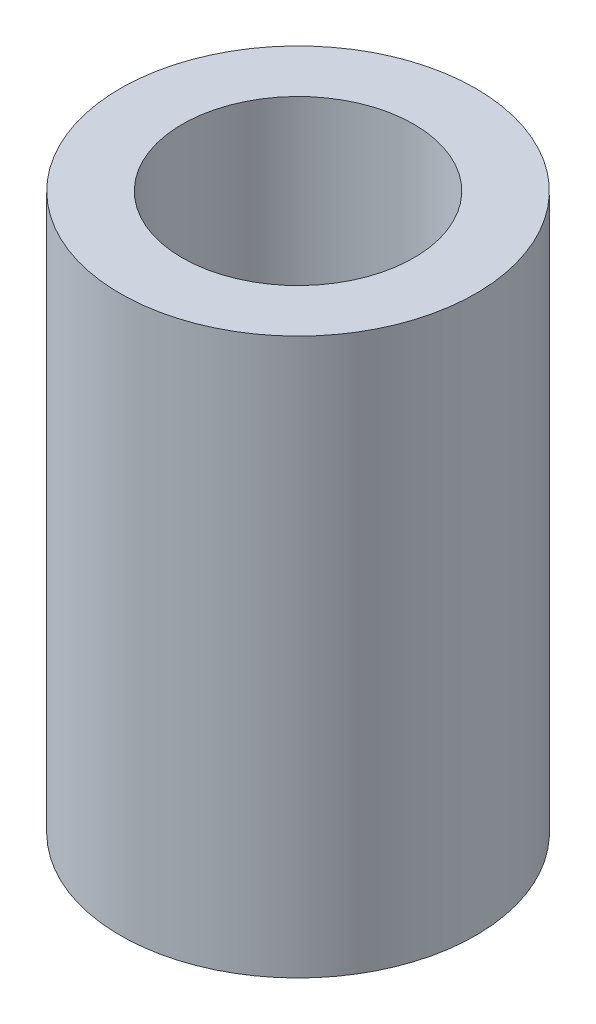
ISO-10303-21;
HEADER;
FILE_DESCRIPTION(('STEP AP214'),'2;1');
FILE_NAME('part.step','',(''),(''),'','','');
FILE_SCHEMA(('AUTOMOTIVE_DESIGN { 1 0 10303 214 1 1 1 1 }'));
ENDSEC;
DATA;
#1=APPLICATION_CONTEXT('core data for automotive mechanical design processes');
#2=APPLICATION_PROTOCOL_DEFINITION('international standard','automotive_design',2000,#1);
#3=PRODUCT_CONTEXT('',#1,'mechanical');
#4=PRODUCT('Part','Part','',(#3));
#5=PRODUCT_RELATED_PRODUCT_CATEGORY('part','',(#4));
#6=PRODUCT_DEFINITION_FORMATION('','',#4);
#7=PRODUCT_DEFINITION_CONTEXT('part definition',#1,'design');
#8=PRODUCT_DEFINITION('design','',#6,#7);
#9=PRODUCT_DEFINITION_SHAPE('','',#8);
#10=(LENGTH_UNIT() NAMED_UNIT(*) SI_UNIT(.MILLI.,.METRE.));
#11=(NAMED_UNIT(*) PLANE_ANGLE_UNIT() SI_UNIT($,.RADIAN.));
#12=(NAMED_UNIT(*) SI_UNIT($,.STERADIAN.) SOLID_ANGLE_UNIT());
#13=UNCERTAINTY_MEASURE_WITH_UNIT(LENGTH_MEASURE(1.E-05),#10,'distance_accuracy_value','');
#14=(GEOMETRIC_REPRESENTATION_CONTEXT(3) GLOBAL_UNCERTAINTY_ASSIGNED_CONTEXT((#13)) GLOBAL_UNIT_ASSIGNED_CONTEXT((#10,
#11,#12)) REPRESENTATION_CONTEXT('',''));
#15=CARTESIAN_POINT('',(0.,0.,0.));
#16=DIRECTION('',(0.,0.,1.));
#17=DIRECTION('',(1.,0.,0.));
#18=AXIS2_PLACEMENT_3D('',#15,#16,#17);
#19=CARTESIAN_POINT('',(0.,7.62,0.));
#20=DIRECTION('',(0.,1.,0.));
#21=DIRECTION('',(0.,0.,1.));
#22=AXIS2_PLACEMENT_3D('',#19,#20,#21);
#23=PLANE('',#22);
#24=CARTESIAN_POINT('',(0.,7.62,0.));
#25=DIRECTION('',(0.,1.,0.));
#26=DIRECTION('',(0.,0.,1.));
#27=AXIS2_PLACEMENT_3D('',#24,#25,#26);
#28=CIRCLE('',#27,2.43608215954706);
#29=CARTESIAN_POINT('',(0.,7.62,-2.43608215954706));
#30=VERTEX_POINT('',#29);
#31=EDGE_CURVE('E10',#30,#30,#28,.T.);
#32=ORIENTED_EDGE('',*,*,#31,.T.);
#33=EDGE_LOOP('',(#32));
#34=FACE_BOUND('',#33,.T.);
#35=CARTESIAN_POINT('',(0.,7.62,0.));
#36=DIRECTION('',(0.,1.,0.));
#37=DIRECTION('',(0.,0.,1.));
#38=AXIS2_PLACEMENT_3D('',#35,#36,#37);
#39=CIRCLE('',#38,1.5875);
#40=CARTESIAN_POINT('',(0.,7.62,-1.5875));
#41=VERTEX_POINT('',#40);
#42=EDGE_CURVE('E48',#41,#41,#39,.T.);
#43=ORIENTED_EDGE('',*,*,#42,.F.);
#44=EDGE_LOOP('',(#43));
#45=FACE_BOUND('',#44,.T.);
#46=ADVANCED_FACE('F37',(#34,#45),#23,.T.);
#47=CARTESIAN_POINT('',(0.,0.,0.));
#48=DIRECTION('',(0.,1.,0.));
#49=DIRECTION('',(0.,0.,1.));
#50=AXIS2_PLACEMENT_3D('',#47,#48,#49);
#51=PLANE('',#50);
#52=CARTESIAN_POINT('',(0.,0.,0.));
#53=DIRECTION('',(0.,1.,0.));
#54=DIRECTION('',(0.,0.,1.));
#55=AXIS2_PLACEMENT_3D('',#52,#53,#54);
#56=CIRCLE('',#55,2.43608215954706);
#57=CARTESIAN_POINT('',(0.,0.,-2.43608215954706));
#58=VERTEX_POINT('',#57);
#59=EDGE_CURVE('E41',#58,#58,#56,.T.);
#60=ORIENTED_EDGE('',*,*,#59,.F.);
#61=EDGE_LOOP('',(#60));
#62=FACE_BOUND('',#61,.T.);
#63=CARTESIAN_POINT('',(0.,0.,0.));
#64=DIRECTION('',(0.,1.,0.));
#65=DIRECTION('',(0.,0.,1.));
#66=AXIS2_PLACEMENT_3D('',#63,#64,#65);
#67=CIRCLE('',#66,1.5875);
#68=CARTESIAN_POINT('',(0.,0.,-1.5875));
#69=VERTEX_POINT('',#68);
#70=EDGE_CURVE('E50',#69,#69,#67,.T.);
#71=ORIENTED_EDGE('',*,*,#70,.T.);
#72=EDGE_LOOP('',(#71));
#73=FACE_BOUND('',#72,.T.);
#74=ADVANCED_FACE('F60',(#62,#73),#51,.F.);
#75=CARTESIAN_POINT('',(0.,7.62,0.));
#76=DIRECTION('',(0.,-1.,0.));
#77=DIRECTION('',(0.,0.,-1.));
#78=AXIS2_PLACEMENT_3D('',#75,#76,#77);
#79=CYLINDRICAL_SURFACE('',#78,2.43608215954706);
#80=CARTESIAN_POINT('',(0.,7.62,-2.43608215954706));
#81=CARTESIAN_POINT('',(0.,7.540625,-2.43608215954706));
#82=CARTESIAN_POINT('',(0.,7.46125,-2.43608215954706));
#83=CARTESIAN_POINT('',(0.,7.3025,-2.43608215954706));
#84=CARTESIAN_POINT('',(0.,7.223125,-2.43608215954706));
#85=CARTESIAN_POINT('',(0.,7.064375,-2.43608215954706));
#86=CARTESIAN_POINT('',(0.,6.985,-2.43608215954706));
#87=CARTESIAN_POINT('',(0.,6.82625,-2.43608215954706));
#88=CARTESIAN_POINT('',(0.,6.746875,-2.43608215954706));
#89=CARTESIAN_POINT('',(0.,6.588125,-2.43608215954706));
#90=CARTESIAN_POINT('',(0.,6.50875,-2.43608215954706));
#91=CARTESIAN_POINT('',(0.,6.35,-2.43608215954706));
#92=CARTESIAN_POINT('',(0.,6.270625,-2.43608215954706));
#93=CARTESIAN_POINT('',(0.,6.111875,-2.43608215954706));
#94=CARTESIAN_POINT('',(0.,6.0325,-2.43608215954706));
#95=CARTESIAN_POINT('',(0.,5.87375,-2.43608215954706));
#96=CARTESIAN_POINT('',(0.,5.794375,-2.43608215954706));
#97=CARTESIAN_POINT('',(0.,5.635625,-2.43608215954706));
#98=CARTESIAN_POINT('',(0.,5.55625,-2.43608215954706));
#99=CARTESIAN_POINT('',(0.,5.3975,-2.43608215954706));
#100=CARTESIAN_POINT('',(0.,5.318125,-2.43608215954706));
#101=CARTESIAN_POINT('',(0.,5.159375,-2.43608215954706));
#102=CARTESIAN_POINT('',(0.,5.08,-2.43608215954706));
#103=CARTESIAN_POINT('',(0.,4.92125,-2.43608215954706));
#104=CARTESIAN_POINT('',(0.,4.841875,-2.43608215954706));
#105=CARTESIAN_POINT('',(0.,4.683125,-2.43608215954706));
#106=CARTESIAN_POINT('',(0.,4.60375,-2.43608215954706));
#107=CARTESIAN_POINT('',(0.,4.445,-2.43608215954706));
#108=CARTESIAN_POINT('',(0.,4.365625,-2.43608215954706));
#109=CARTESIAN_POINT('',(0.,4.206875,-2.43608215954706));
#110=CARTESIAN_POINT('',(0.,4.1275,-2.43608215954706));
#111=CARTESIAN_POINT('',(0.,3.96875,-2.43608215954706));
#112=CARTESIAN_POINT('',(0.,3.889375,-2.43608215954706));
#113=CARTESIAN_POINT('',(0.,3.730625,-2.43608215954706));
#114=CARTESIAN_POINT('',(0.,3.65125,-2.43608215954706));
#115=CARTESIAN_POINT('',(0.,3.4925,-2.43608215954706));
#116=CARTESIAN_POINT('',(0.,3.413125,-2.43608215954706));
#117=CARTESIAN_POINT('',(0.,3.254375,-2.43608215954706));
#118=CARTESIAN_POINT('',(0.,3.175,-2.43608215954706));
#119=CARTESIAN_POINT('',(0.,3.01625,-2.43608215954706));
#120=CARTESIAN_POINT('',(0.,2.936875,-2.43608215954706));
#121=CARTESIAN_POINT('',(0.,2.778125,-2.43608215954706));
#122=CARTESIAN_POINT('',(0.,2.69875,-2.43608215954706));
#123=CARTESIAN_POINT('',(0.,2.54,-2.43608215954706));
#124=CARTESIAN_POINT('',(0.,2.460625,-2.43608215954706));
#125=CARTESIAN_POINT('',(0.,2.301875,-2.43608215954706));
#126=CARTESIAN_POINT('',(0.,2.2225,-2.43608215954706));
#127=CARTESIAN_POINT('',(0.,2.06375,-2.43608215954706));
#128=CARTESIAN_POINT('',(0.,1.984375,-2.43608215954706));
#129=CARTESIAN_POINT('',(0.,1.825625,-2.43608215954706));
#130=CARTESIAN_POINT('',(0.,1.74625,-2.43608215954706));
#131=CARTESIAN_POINT('',(0.,1.5875,-2.43608215954706));
#132=CARTESIAN_POINT('',(0.,1.508125,-2.43608215954706));
#133=CARTESIAN_POINT('',(0.,1.349375,-2.43608215954706));
#134=CARTESIAN_POINT('',(0.,1.27,-2.43608215954706));
#135=CARTESIAN_POINT('',(0.,1.11125,-2.43608215954706));
#136=CARTESIAN_POINT('',(0.,1.031875,-2.43608215954706));
#137=CARTESIAN_POINT('',(0.,0.873125,-2.43608215954706));
#138=CARTESIAN_POINT('',(0.,0.79375,-2.43608215954706));
#139=CARTESIAN_POINT('',(0.,0.635,-2.43608215954706));
#140=CARTESIAN_POINT('',(0.,0.555625,-2.43608215954706));
#141=CARTESIAN_POINT('',(0.,0.396875,-2.43608215954706));
#142=CARTESIAN_POINT('',(0.,0.3175,-2.43608215954706));
#143=CARTESIAN_POINT('',(0.,0.15875,-2.43608215954706));
#144=CARTESIAN_POINT('',(0.,0.0793749999999999,-2.43608215954706));
#145=CARTESIAN_POINT('',(0.,0.,-2.43608215954706));
#146=B_SPLINE_CURVE_WITH_KNOTS('',3,(#80,#81,#82,#83,#84,#85,#86,#87,#88,#89,#90,#91,#92,#93,
#94,#95,#96,#97,#98,#99,#100,#101,#102,#103,#104,#105,#106,#107,#108,#109,#110,#111,#112,#113,
#114,#115,#116,#117,#118,#119,#120,#121,#122,#123,#124,#125,#126,#127,#128,#129,#130,#131,#132,
#133,#134,#135,#136,#137,#138,#139,#140,#141,#142,#143,#144,#145),.UNSPECIFIED.,.F.,.F.,(4,2,2,
2,2,2,2,2,2,2,2,2,2,2,2,2,2,2,2,2,2,2,2,2,2,2,2,2,2,2,2,2,4),(0.,0.238125,0.47625,
0.714375000000001,0.9525,1.190625,1.42875,1.666875,1.905,2.143125,2.38125,2.619375,2.8575,
3.095625,3.33375,3.571875,3.81,4.048125,4.28625,4.524375,4.7625,5.000625,5.23875,5.476875,5.715,
5.953125,6.19125,6.429375,6.6675,6.905625,7.14375,7.381875,7.62),.UNSPECIFIED.);
#147=EDGE_CURVE('BSEAM39',#30,#58,#146,.T.);
#148=ORIENTED_EDGE('',*,*,#31,.F.);
#149=ORIENTED_EDGE('',*,*,#59,.T.);
#150=ORIENTED_EDGE('',*,*,#147,.T.);
#151=ORIENTED_EDGE('',*,*,#147,.F.);
#152=EDGE_LOOP('',(#148,#150,#149,#151));
#153=FACE_BOUND('',#152,.T.);
#154=ADVANCED_FACE('F39',(#153),#79,.T.);
#155=CARTESIAN_POINT('',(0.,7.62,0.));
#156=DIRECTION('',(0.,-1.,0.));
#157=DIRECTION('',(0.,0.,-1.));
#158=AXIS2_PLACEMENT_3D('',#155,#156,#157);
#159=CYLINDRICAL_SURFACE('',#158,1.5875);
#160=CARTESIAN_POINT('',(0.,7.62,-1.5875));
#161=CARTESIAN_POINT('',(0.,7.540625,-1.5875));
#162=CARTESIAN_POINT('',(0.,7.46125,-1.5875));
#163=CARTESIAN_POINT('',(0.,7.3025,-1.5875));
#164=CARTESIAN_POINT('',(0.,7.223125,-1.5875));
#165=CARTESIAN_POINT('',(0.,7.064375,-1.5875));
#166=CARTESIAN_POINT('',(0.,6.985,-1.5875));
#167=CARTESIAN_POINT('',(0.,6.82625,-1.5875));
#168=CARTESIAN_POINT('',(0.,6.746875,-1.5875));
#169=CARTESIAN_POINT('',(0.,6.588125,-1.5875));
#170=CARTESIAN_POINT('',(0.,6.50875,-1.5875));
#171=CARTESIAN_POINT('',(0.,6.35,-1.5875));
#172=CARTESIAN_POINT('',(0.,6.270625,-1.5875));
#173=CARTESIAN_POINT('',(0.,6.111875,-1.5875));
#174=CARTESIAN_POINT('',(0.,6.0325,-1.5875));
#175=CARTESIAN_POINT('',(0.,5.87375,-1.5875));
#176=CARTESIAN_POINT('',(0.,5.794375,-1.5875));
#177=CARTESIAN_POINT('',(0.,5.635625,-1.5875));
#178=CARTESIAN_POINT('',(0.,5.55625,-1.5875));
#179=CARTESIAN_POINT('',(0.,5.3975,-1.5875));
#180=CARTESIAN_POINT('',(0.,5.318125,-1.5875));
#181=CARTESIAN_POINT('',(0.,5.159375,-1.5875));
#182=CARTESIAN_POINT('',(0.,5.08,-1.5875));
#183=CARTESIAN_POINT('',(0.,4.92125,-1.5875));
#184=CARTESIAN_POINT('',(0.,4.841875,-1.5875));
#185=CARTESIAN_POINT('',(0.,4.683125,-1.5875));
#186=CARTESIAN_POINT('',(0.,4.60375,-1.5875));
#187=CARTESIAN_POINT('',(0.,4.445,-1.5875));
#188=CARTESIAN_POINT('',(0.,4.365625,-1.5875));
#189=CARTESIAN_POINT('',(0.,4.206875,-1.5875));
#190=CARTESIAN_POINT('',(0.,4.1275,-1.5875));
#191=CARTESIAN_POINT('',(0.,3.96875,-1.5875));
#192=CARTESIAN_POINT('',(0.,3.889375,-1.5875));
#193=CARTESIAN_POINT('',(0.,3.730625,-1.5875));
#194=CARTESIAN_POINT('',(0.,3.65125,-1.5875));
#195=CARTESIAN_POINT('',(0.,3.4925,-1.5875));
#196=CARTESIAN_POINT('',(0.,3.413125,-1.5875));
#197=CARTESIAN_POINT('',(0.,3.254375,-1.5875));
#198=CARTESIAN_POINT('',(0.,3.175,-1.5875));
#199=CARTESIAN_POINT('',(0.,3.01625,-1.5875));
#200=CARTESIAN_POINT('',(0.,2.936875,-1.5875));
#201=CARTESIAN_POINT('',(0.,2.778125,-1.5875));
#202=CARTESIAN_POINT('',(0.,2.69875,-1.5875));
#203=CARTESIAN_POINT('',(0.,2.54,-1.5875));
#204=CARTESIAN_POINT('',(0.,2.460625,-1.5875));
#205=CARTESIAN_POINT('',(0.,2.301875,-1.5875));
#206=CARTESIAN_POINT('',(0.,2.2225,-1.5875));
#207=CARTESIAN_POINT('',(0.,2.06375,-1.5875));
#208=CARTESIAN_POINT('',(0.,1.984375,-1.5875));
#209=CARTESIAN_POINT('',(0.,1.825625,-1.5875));
#210=CARTESIAN_POINT('',(0.,1.74625,-1.5875));
#211=CARTESIAN_POINT('',(0.,1.5875,-1.5875));
#212=CARTESIAN_POINT('',(0.,1.508125,-1.5875));
#213=CARTESIAN_POINT('',(0.,1.349375,-1.5875));
#214=CARTESIAN_POINT('',(0.,1.27,-1.5875));
#215=CARTESIAN_POINT('',(0.,1.11125,-1.5875));
#216=CARTESIAN_POINT('',(0.,1.031875,-1.5875));
#217=CARTESIAN_POINT('',(0.,0.873125,-1.5875));
#218=CARTESIAN_POINT('',(0.,0.79375,-1.5875));
#219=CARTESIAN_POINT('',(0.,0.635,-1.5875));
#220=CARTESIAN_POINT('',(0.,0.555625,-1.5875));
#221=CARTESIAN_POINT('',(0.,0.396875,-1.5875));
#222=CARTESIAN_POINT('',(0.,0.3175,-1.5875));
#223=CARTESIAN_POINT('',(0.,0.15875,-1.5875));
#224=CARTESIAN_POINT('',(0.,0.0793749999999999,-1.5875));
#225=CARTESIAN_POINT('',(0.,0.,-1.5875));
#226=B_SPLINE_CURVE_WITH_KNOTS('',3,(#160,#161,#162,#163,#164,#165,#166,#167,#168,#169,#170,
#171,#172,#173,#174,#175,#176,#177,#178,#179,#180,#181,#182,#183,#184,#185,#186,#187,#188,#189,
#190,#191,#192,#193,#194,#195,#196,#197,#198,#199,#200,#201,#202,#203,#204,#205,#206,#207,#208,
#209,#210,#211,#212,#213,#214,#215,#216,#217,#218,#219,#220,#221,#222,#223,#224,#225),
.UNSPECIFIED.,.F.,.F.,(4,2,2,2,2,2,2,2,2,2,2,2,2,2,2,2,2,2,2,2,2,2,2,2,2,2,2,2,2,2,2,2,4),(0.,
0.238125,0.476249999999999,0.714375,0.952499999999999,1.190625,1.42875,1.666875,1.905,2.143125,
2.38125,2.619375,2.8575,3.095625,3.33375,3.571875,3.81,4.048125,4.28625,4.524375,4.7625,
5.000625,5.23875,5.476875,5.715,5.953125,6.19125,6.429375,6.6675,6.905625,7.14375,7.381875,
7.62),.UNSPECIFIED.);
#227=EDGE_CURVE('BSEAM56',#41,#69,#226,.T.);
#228=ORIENTED_EDGE('',*,*,#42,.T.);
#229=ORIENTED_EDGE('',*,*,#70,.F.);
#230=ORIENTED_EDGE('',*,*,#227,.T.);
#231=ORIENTED_EDGE('',*,*,#227,.F.);
#232=EDGE_LOOP('',(#228,#230,#229,#231));
#233=FACE_BOUND('',#232,.T.);
#234=ADVANCED_FACE('F56',(#233),#159,.F.);
#235=CLOSED_SHELL('',(#46,#74,#154,#234));
#236=MANIFOLD_SOLID_BREP('B2',#235);
#237=ADVANCED_BREP_SHAPE_REPRESENTATION('',(#18,#236),#14);
#238=SHAPE_DEFINITION_REPRESENTATION(#9,#237);
ENDSEC;
END-ISO-10303-21;
